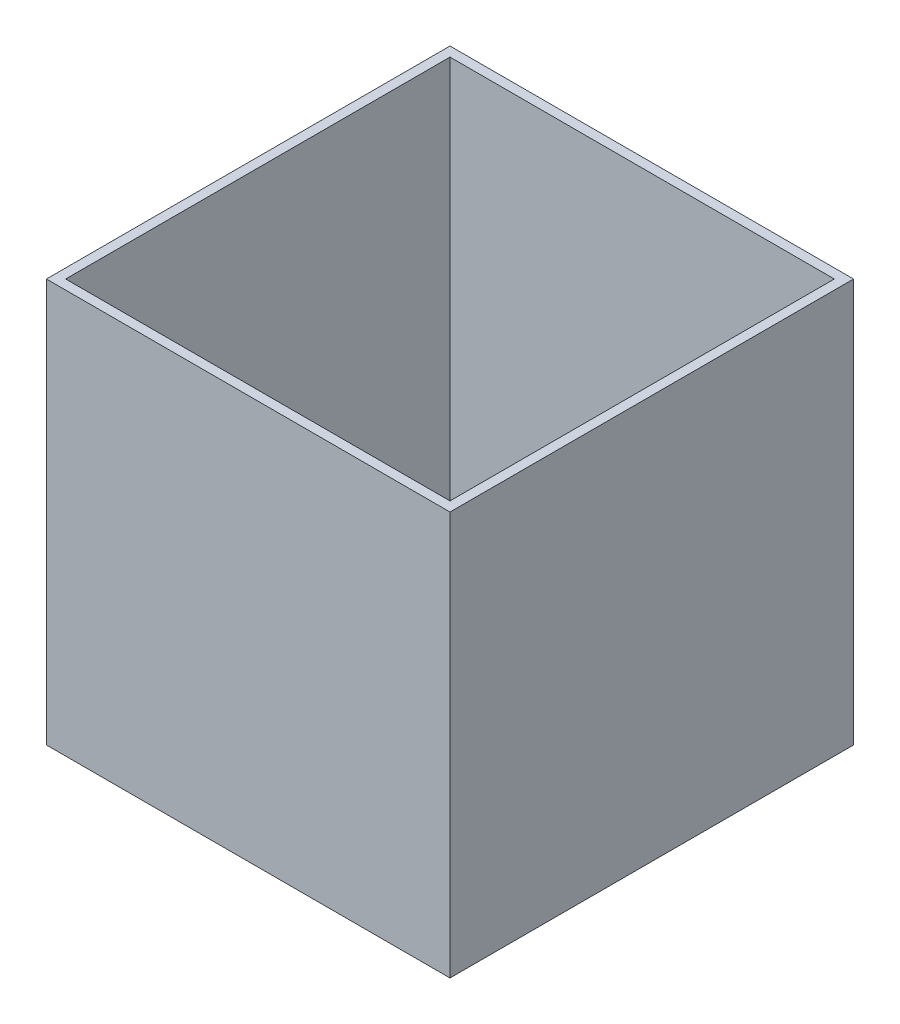
ISO-10303-21;
HEADER;
FILE_DESCRIPTION(('STEP AP214'),'2;1');
FILE_NAME('part.step','',(''),(''),'','','');
FILE_SCHEMA(('AUTOMOTIVE_DESIGN { 1 0 10303 214 1 1 1 1 }'));
ENDSEC;
DATA;
#1=APPLICATION_CONTEXT('core data for automotive mechanical design processes');
#2=APPLICATION_PROTOCOL_DEFINITION('international standard','automotive_design',2000,#1);
#3=PRODUCT_CONTEXT('',#1,'mechanical');
#4=PRODUCT('Part','Part','',(#3));
#5=PRODUCT_RELATED_PRODUCT_CATEGORY('part','',(#4));
#6=PRODUCT_DEFINITION_FORMATION('','',#4);
#7=PRODUCT_DEFINITION_CONTEXT('part definition',#1,'design');
#8=PRODUCT_DEFINITION('design','',#6,#7);
#9=PRODUCT_DEFINITION_SHAPE('','',#8);
#10=(LENGTH_UNIT() NAMED_UNIT(*) SI_UNIT(.MILLI.,.METRE.));
#11=(NAMED_UNIT(*) PLANE_ANGLE_UNIT() SI_UNIT($,.RADIAN.));
#12=(NAMED_UNIT(*) SI_UNIT($,.STERADIAN.) SOLID_ANGLE_UNIT());
#13=UNCERTAINTY_MEASURE_WITH_UNIT(LENGTH_MEASURE(1.E-05),#10,'distance_accuracy_value','');
#14=(GEOMETRIC_REPRESENTATION_CONTEXT(3) GLOBAL_UNCERTAINTY_ASSIGNED_CONTEXT((#13)) GLOBAL_UNIT_ASSIGNED_CONTEXT((#10,
#11,#12)) REPRESENTATION_CONTEXT('',''));
#15=CARTESIAN_POINT('',(0.,0.,0.));
#16=DIRECTION('',(0.,0.,1.));
#17=DIRECTION('',(1.,0.,0.));
#18=AXIS2_PLACEMENT_3D('',#15,#16,#17);
#19=CARTESIAN_POINT('',(0.,210.,0.));
#20=DIRECTION('',(0.,1.,0.));
#21=DIRECTION('',(0.,0.,1.));
#22=AXIS2_PLACEMENT_3D('',#19,#20,#21);
#23=PLANE('',#22);
#24=DIRECTION('',(0.,0.,-1.));
#25=VECTOR('',#24,1.);
#26=CARTESIAN_POINT('',(105.,210.,-105.));
#27=LINE('',#26,#25);
#28=CARTESIAN_POINT('',(105.,210.,105.));
#29=VERTEX_POINT('',#28);
#30=CARTESIAN_POINT('',(105.,210.,-105.));
#31=VERTEX_POINT('',#30);
#32=EDGE_CURVE('E149',#29,#31,#27,.T.);
#33=ORIENTED_EDGE('',*,*,#32,.T.);
#34=DIRECTION('',(-1.,0.,0.));
#35=VECTOR('',#34,1.);
#36=CARTESIAN_POINT('',(-105.,210.,-105.));
#37=LINE('',#36,#35);
#38=CARTESIAN_POINT('',(-105.,210.,-105.));
#39=VERTEX_POINT('',#38);
#40=EDGE_CURVE('E93',#31,#39,#37,.T.);
#41=ORIENTED_EDGE('',*,*,#40,.T.);
#42=DIRECTION('',(0.,0.,1.));
#43=VECTOR('',#42,1.);
#44=CARTESIAN_POINT('',(-105.,210.,-105.));
#45=LINE('',#44,#43);
#46=CARTESIAN_POINT('',(-105.,210.,105.));
#47=VERTEX_POINT('',#46);
#48=EDGE_CURVE('E152',#39,#47,#45,.T.);
#49=ORIENTED_EDGE('',*,*,#48,.T.);
#50=DIRECTION('',(1.,0.,0.));
#51=VECTOR('',#50,1.);
#52=CARTESIAN_POINT('',(-105.,210.,105.));
#53=LINE('',#52,#51);
#54=EDGE_CURVE('E65',#47,#29,#53,.T.);
#55=ORIENTED_EDGE('',*,*,#54,.T.);
#56=EDGE_LOOP('',(#33,#41,#49,#55));
#57=FACE_BOUND('',#56,.T.);
#58=DIRECTION('',(0.,0.,1.));
#59=VECTOR('',#58,1.);
#60=CARTESIAN_POINT('',(100.,210.,0.));
#61=LINE('',#60,#59);
#62=CARTESIAN_POINT('',(100.,210.,-100.));
#63=VERTEX_POINT('',#62);
#64=CARTESIAN_POINT('',(100.,210.,100.));
#65=VERTEX_POINT('',#64);
#66=EDGE_CURVE('E125',#63,#65,#61,.T.);
#67=ORIENTED_EDGE('',*,*,#66,.T.);
#68=DIRECTION('',(-1.,0.,0.));
#69=VECTOR('',#68,1.);
#70=CARTESIAN_POINT('',(0.,210.,100.));
#71=LINE('',#70,#69);
#72=CARTESIAN_POINT('',(-100.,210.,100.));
#73=VERTEX_POINT('',#72);
#74=EDGE_CURVE('E131',#65,#73,#71,.T.);
#75=ORIENTED_EDGE('',*,*,#74,.T.);
#76=DIRECTION('',(0.,0.,-1.));
#77=VECTOR('',#76,1.);
#78=CARTESIAN_POINT('',(-100.,210.,0.));
#79=LINE('',#78,#77);
#80=CARTESIAN_POINT('',(-100.,210.,-100.));
#81=VERTEX_POINT('',#80);
#82=EDGE_CURVE('E135',#73,#81,#79,.T.);
#83=ORIENTED_EDGE('',*,*,#82,.T.);
#84=DIRECTION('',(1.,0.,0.));
#85=VECTOR('',#84,1.);
#86=CARTESIAN_POINT('',(0.,210.,-100.));
#87=LINE('',#86,#85);
#88=EDGE_CURVE('E56',#81,#63,#87,.T.);
#89=ORIENTED_EDGE('',*,*,#88,.T.);
#90=EDGE_LOOP('',(#67,#75,#83,#89));
#91=FACE_BOUND('',#90,.T.);
#92=ADVANCED_FACE('F41',(#57,#91),#23,.T.);
#93=CARTESIAN_POINT('',(105.,210.,-105.));
#94=DIRECTION('',(-1.,0.,0.));
#95=DIRECTION('',(0.,0.,1.));
#96=AXIS2_PLACEMENT_3D('',#93,#94,#95);
#97=PLANE('',#96);
#98=DIRECTION('',(0.,0.,-1.));
#99=VECTOR('',#98,1.);
#100=CARTESIAN_POINT('',(105.,0.,-105.));
#101=LINE('',#100,#99);
#102=CARTESIAN_POINT('',(105.,0.,105.));
#103=VERTEX_POINT('',#102);
#104=CARTESIAN_POINT('',(105.,0.,-105.));
#105=VERTEX_POINT('',#104);
#106=EDGE_CURVE('E156',#103,#105,#101,.T.);
#107=ORIENTED_EDGE('',*,*,#106,.T.);
#108=DIRECTION('',(0.,-1.,0.));
#109=VECTOR('',#108,1.);
#110=CARTESIAN_POINT('',(105.,210.,-105.));
#111=LINE('',#110,#109);
#112=EDGE_CURVE('E12',#31,#105,#111,.T.);
#113=ORIENTED_EDGE('',*,*,#112,.F.);
#114=ORIENTED_EDGE('',*,*,#32,.F.);
#115=DIRECTION('',(0.,-1.,0.));
#116=VECTOR('',#115,1.);
#117=CARTESIAN_POINT('',(105.,210.,105.));
#118=LINE('',#117,#116);
#119=EDGE_CURVE('E155',#29,#103,#118,.T.);
#120=ORIENTED_EDGE('',*,*,#119,.T.);
#121=EDGE_LOOP('',(#107,#113,#114,#120));
#122=FACE_BOUND('',#121,.T.);
#123=ADVANCED_FACE('F43',(#122),#97,.F.);
#124=CARTESIAN_POINT('',(-105.,210.,-105.));
#125=DIRECTION('',(0.,0.,1.));
#126=DIRECTION('',(1.,0.,0.));
#127=AXIS2_PLACEMENT_3D('',#124,#125,#126);
#128=PLANE('',#127);
#129=DIRECTION('',(-1.,0.,0.));
#130=VECTOR('',#129,1.);
#131=CARTESIAN_POINT('',(-105.,0.,-105.));
#132=LINE('',#131,#130);
#133=CARTESIAN_POINT('',(-105.,0.,-105.));
#134=VERTEX_POINT('',#133);
#135=EDGE_CURVE('E159',#105,#134,#132,.T.);
#136=ORIENTED_EDGE('',*,*,#135,.T.);
#137=DIRECTION('',(0.,-1.,0.));
#138=VECTOR('',#137,1.);
#139=CARTESIAN_POINT('',(-105.,210.,-105.));
#140=LINE('',#139,#138);
#141=EDGE_CURVE('E49',#39,#134,#140,.T.);
#142=ORIENTED_EDGE('',*,*,#141,.F.);
#143=ORIENTED_EDGE('',*,*,#40,.F.);
#144=ORIENTED_EDGE('',*,*,#112,.T.);
#145=EDGE_LOOP('',(#136,#142,#143,#144));
#146=FACE_BOUND('',#145,.T.);
#147=ADVANCED_FACE('F188',(#146),#128,.F.);
#148=CARTESIAN_POINT('',(-105.,210.,-105.));
#149=DIRECTION('',(1.,0.,0.));
#150=DIRECTION('',(0.,0.,-1.));
#151=AXIS2_PLACEMENT_3D('',#148,#149,#150);
#152=PLANE('',#151);
#153=DIRECTION('',(0.,0.,1.));
#154=VECTOR('',#153,1.);
#155=CARTESIAN_POINT('',(-105.,0.,-105.));
#156=LINE('',#155,#154);
#157=CARTESIAN_POINT('',(-105.,0.,105.));
#158=VERTEX_POINT('',#157);
#159=EDGE_CURVE('E162',#134,#158,#156,.T.);
#160=ORIENTED_EDGE('',*,*,#159,.T.);
#161=DIRECTION('',(0.,-1.,0.));
#162=VECTOR('',#161,1.);
#163=CARTESIAN_POINT('',(-105.,210.,105.));
#164=LINE('',#163,#162);
#165=EDGE_CURVE('E166',#47,#158,#164,.T.);
#166=ORIENTED_EDGE('',*,*,#165,.F.);
#167=ORIENTED_EDGE('',*,*,#48,.F.);
#168=ORIENTED_EDGE('',*,*,#141,.T.);
#169=EDGE_LOOP('',(#160,#166,#167,#168));
#170=FACE_BOUND('',#169,.T.);
#171=ADVANCED_FACE('F171',(#170),#152,.F.);
#172=CARTESIAN_POINT('',(-105.,210.,105.));
#173=DIRECTION('',(0.,0.,-1.));
#174=DIRECTION('',(-1.,0.,0.));
#175=AXIS2_PLACEMENT_3D('',#172,#173,#174);
#176=PLANE('',#175);
#177=DIRECTION('',(1.,0.,0.));
#178=VECTOR('',#177,1.);
#179=CARTESIAN_POINT('',(-105.,0.,105.));
#180=LINE('',#179,#178);
#181=EDGE_CURVE('E86',#158,#103,#180,.T.);
#182=ORIENTED_EDGE('',*,*,#181,.T.);
#183=ORIENTED_EDGE('',*,*,#119,.F.);
#184=ORIENTED_EDGE('',*,*,#54,.F.);
#185=ORIENTED_EDGE('',*,*,#165,.T.);
#186=EDGE_LOOP('',(#182,#183,#184,#185));
#187=FACE_BOUND('',#186,.T.);
#188=ADVANCED_FACE('F179',(#187),#176,.F.);
#189=CARTESIAN_POINT('',(0.,0.,0.));
#190=DIRECTION('',(0.,1.,0.));
#191=DIRECTION('',(0.,0.,1.));
#192=AXIS2_PLACEMENT_3D('',#189,#190,#191);
#193=PLANE('',#192);
#194=ORIENTED_EDGE('',*,*,#106,.F.);
#195=ORIENTED_EDGE('',*,*,#181,.F.);
#196=ORIENTED_EDGE('',*,*,#159,.F.);
#197=ORIENTED_EDGE('',*,*,#135,.F.);
#198=EDGE_LOOP('',(#194,#195,#196,#197));
#199=FACE_BOUND('',#198,.T.);
#200=ADVANCED_FACE('F175',(#199),#193,.F.);
#201=CARTESIAN_POINT('',(0.,-282.842712474619,100.));
#202=DIRECTION('',(0.,0.,-1.));
#203=DIRECTION('',(-1.,0.,0.));
#204=AXIS2_PLACEMENT_3D('',#201,#202,#203);
#205=PLANE('',#204);
#206=DIRECTION('',(0.,1.,0.));
#207=VECTOR('',#206,1.);
#208=CARTESIAN_POINT('',(-100.,-282.842712474619,100.));
#209=LINE('',#208,#207);
#210=CARTESIAN_POINT('',(-100.,10.,100.));
#211=VERTEX_POINT('',#210);
#212=EDGE_CURVE('E141',#211,#73,#209,.T.);
#213=ORIENTED_EDGE('',*,*,#212,.T.);
#214=ORIENTED_EDGE('',*,*,#74,.F.);
#215=DIRECTION('',(0.,1.,0.));
#216=VECTOR('',#215,1.);
#217=CARTESIAN_POINT('',(100.,-282.842712474619,100.));
#218=LINE('',#217,#216);
#219=CARTESIAN_POINT('',(100.,10.,100.));
#220=VERTEX_POINT('',#219);
#221=EDGE_CURVE('E122',#220,#65,#218,.T.);
#222=ORIENTED_EDGE('',*,*,#221,.F.);
#223=DIRECTION('',(1.,0.,0.));
#224=VECTOR('',#223,1.);
#225=CARTESIAN_POINT('',(0.,10.,100.));
#226=LINE('',#225,#224);
#227=EDGE_CURVE('E145',#211,#220,#226,.T.);
#228=ORIENTED_EDGE('',*,*,#227,.F.);
#229=EDGE_LOOP('',(#213,#214,#222,#228));
#230=FACE_BOUND('',#229,.T.);
#231=ADVANCED_FACE('F186',(#230),#205,.T.);
#232=CARTESIAN_POINT('',(100.,-282.842712474619,0.));
#233=DIRECTION('',(-1.,0.,0.));
#234=DIRECTION('',(0.,0.,1.));
#235=AXIS2_PLACEMENT_3D('',#232,#233,#234);
#236=PLANE('',#235);
#237=ORIENTED_EDGE('',*,*,#221,.T.);
#238=ORIENTED_EDGE('',*,*,#66,.F.);
#239=DIRECTION('',(0.,1.,0.));
#240=VECTOR('',#239,1.);
#241=CARTESIAN_POINT('',(100.,-282.842712474619,-100.));
#242=LINE('',#241,#240);
#243=CARTESIAN_POINT('',(100.,10.,-100.));
#244=VERTEX_POINT('',#243);
#245=EDGE_CURVE('E114',#244,#63,#242,.T.);
#246=ORIENTED_EDGE('',*,*,#245,.F.);
#247=DIRECTION('',(0.,0.,-1.));
#248=VECTOR('',#247,1.);
#249=CARTESIAN_POINT('',(100.,10.,0.));
#250=LINE('',#249,#248);
#251=EDGE_CURVE('E148',#220,#244,#250,.T.);
#252=ORIENTED_EDGE('',*,*,#251,.F.);
#253=EDGE_LOOP('',(#237,#238,#246,#252));
#254=FACE_BOUND('',#253,.T.);
#255=ADVANCED_FACE('F126',(#254),#236,.T.);
#256=CARTESIAN_POINT('',(0.,-282.842712474619,-100.));
#257=DIRECTION('',(0.,0.,1.));
#258=DIRECTION('',(1.,0.,0.));
#259=AXIS2_PLACEMENT_3D('',#256,#257,#258);
#260=PLANE('',#259);
#261=ORIENTED_EDGE('',*,*,#245,.T.);
#262=ORIENTED_EDGE('',*,*,#88,.F.);
#263=DIRECTION('',(0.,1.,0.));
#264=VECTOR('',#263,1.);
#265=CARTESIAN_POINT('',(-100.,-282.842712474619,-100.));
#266=LINE('',#265,#264);
#267=CARTESIAN_POINT('',(-100.,10.,-100.));
#268=VERTEX_POINT('',#267);
#269=EDGE_CURVE('E121',#268,#81,#266,.T.);
#270=ORIENTED_EDGE('',*,*,#269,.F.);
#271=DIRECTION('',(-1.,0.,0.));
#272=VECTOR('',#271,1.);
#273=CARTESIAN_POINT('',(0.,10.,-100.));
#274=LINE('',#273,#272);
#275=EDGE_CURVE('E118',#244,#268,#274,.T.);
#276=ORIENTED_EDGE('',*,*,#275,.F.);
#277=EDGE_LOOP('',(#261,#262,#270,#276));
#278=FACE_BOUND('',#277,.T.);
#279=ADVANCED_FACE('F116',(#278),#260,.T.);
#280=CARTESIAN_POINT('',(-100.,-282.842712474619,0.));
#281=DIRECTION('',(1.,0.,0.));
#282=DIRECTION('',(0.,0.,-1.));
#283=AXIS2_PLACEMENT_3D('',#280,#281,#282);
#284=PLANE('',#283);
#285=ORIENTED_EDGE('',*,*,#269,.T.);
#286=ORIENTED_EDGE('',*,*,#82,.F.);
#287=ORIENTED_EDGE('',*,*,#212,.F.);
#288=DIRECTION('',(0.,0.,1.));
#289=VECTOR('',#288,1.);
#290=CARTESIAN_POINT('',(-100.,10.,0.));
#291=LINE('',#290,#289);
#292=EDGE_CURVE('E160',#268,#211,#291,.T.);
#293=ORIENTED_EDGE('',*,*,#292,.F.);
#294=EDGE_LOOP('',(#285,#286,#287,#293));
#295=FACE_BOUND('',#294,.T.);
#296=ADVANCED_FACE('F196',(#295),#284,.T.);
#297=CARTESIAN_POINT('',(0.,10.,0.));
#298=DIRECTION('',(0.,1.,0.));
#299=DIRECTION('',(0.,0.,1.));
#300=AXIS2_PLACEMENT_3D('',#297,#298,#299);
#301=PLANE('',#300);
#302=ORIENTED_EDGE('',*,*,#275,.T.);
#303=ORIENTED_EDGE('',*,*,#292,.T.);
#304=ORIENTED_EDGE('',*,*,#227,.T.);
#305=ORIENTED_EDGE('',*,*,#251,.T.);
#306=EDGE_LOOP('',(#302,#303,#304,#305));
#307=FACE_BOUND('',#306,.T.);
#308=ADVANCED_FACE('F199',(#307),#301,.T.);
#309=CLOSED_SHELL('',(#92,#123,#147,#171,#188,#200,#231,#255,#279,#296,#308));
#310=MANIFOLD_SOLID_BREP('B2',#309);
#311=ADVANCED_BREP_SHAPE_REPRESENTATION('',(#18,#310),#14);
#312=SHAPE_DEFINITION_REPRESENTATION(#9,#311);
ENDSEC;
END-ISO-10303-21;
